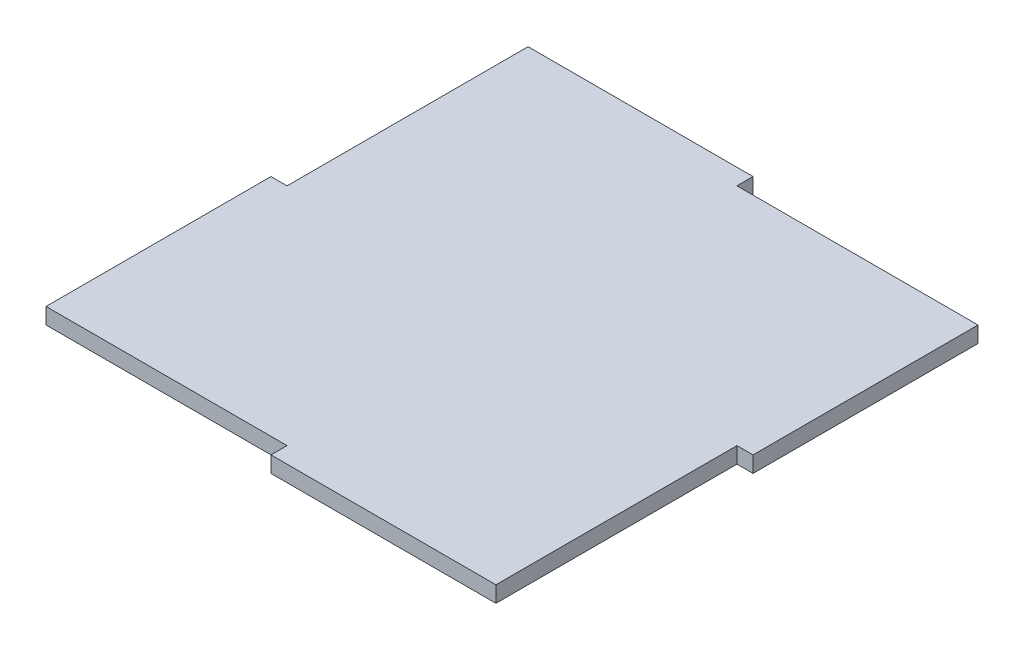
ISO-10303-21;
HEADER;
FILE_DESCRIPTION(('STEP AP214'),'2;1');
FILE_NAME('part.step','',(''),(''),'','','');
FILE_SCHEMA(('AUTOMOTIVE_DESIGN { 1 0 10303 214 1 1 1 1 }'));
ENDSEC;
DATA;
#1=APPLICATION_CONTEXT('core data for automotive mechanical design processes');
#2=APPLICATION_PROTOCOL_DEFINITION('international standard','automotive_design',2000,#1);
#3=PRODUCT_CONTEXT('',#1,'mechanical');
#4=PRODUCT('Part','Part','',(#3));
#5=PRODUCT_RELATED_PRODUCT_CATEGORY('part','',(#4));
#6=PRODUCT_DEFINITION_FORMATION('','',#4);
#7=PRODUCT_DEFINITION_CONTEXT('part definition',#1,'design');
#8=PRODUCT_DEFINITION('design','',#6,#7);
#9=PRODUCT_DEFINITION_SHAPE('','',#8);
#10=(LENGTH_UNIT() NAMED_UNIT(*) SI_UNIT(.MILLI.,.METRE.));
#11=(NAMED_UNIT(*) PLANE_ANGLE_UNIT() SI_UNIT($,.RADIAN.));
#12=(NAMED_UNIT(*) SI_UNIT($,.STERADIAN.) SOLID_ANGLE_UNIT());
#13=UNCERTAINTY_MEASURE_WITH_UNIT(LENGTH_MEASURE(1.E-05),#10,'distance_accuracy_value','');
#14=(GEOMETRIC_REPRESENTATION_CONTEXT(3) GLOBAL_UNCERTAINTY_ASSIGNED_CONTEXT((#13)) GLOBAL_UNIT_ASSIGNED_CONTEXT((#10,
#11,#12)) REPRESENTATION_CONTEXT('',''));
#15=CARTESIAN_POINT('',(0.,0.,0.));
#16=DIRECTION('',(0.,0.,1.));
#17=DIRECTION('',(1.,0.,0.));
#18=AXIS2_PLACEMENT_3D('',#15,#16,#17);
#19=CARTESIAN_POINT('',(0.,6.35,-4.41271186440678));
#20=DIRECTION('',(0.,0.,-1.));
#21=DIRECTION('',(-1.,0.,0.));
#22=AXIS2_PLACEMENT_3D('',#19,#20,#21);
#23=PLANE('',#22);
#24=DIRECTION('',(1.,0.,0.));
#25=VECTOR('',#24,1.);
#26=CARTESIAN_POINT('',(0.,0.,-4.41271186440678));
#27=LINE('',#26,#25);
#28=CARTESIAN_POINT('',(-118.856214689266,0.,-4.41271186440677));
#29=VERTEX_POINT('',#28);
#30=CARTESIAN_POINT('',(-112.506214689266,0.,-4.41271186440677));
#31=VERTEX_POINT('',#30);
#32=EDGE_CURVE('E154',#29,#31,#27,.T.);
#33=ORIENTED_EDGE('',*,*,#32,.F.);
#34=DIRECTION('',(0.,-1.,0.));
#35=VECTOR('',#34,1.);
#36=CARTESIAN_POINT('',(-118.856214689266,6.35,-4.41271186440677));
#37=LINE('',#36,#35);
#38=CARTESIAN_POINT('',(-118.856214689266,6.35,-4.41271186440677));
#39=VERTEX_POINT('',#38);
#40=EDGE_CURVE('E11',#39,#29,#37,.T.);
#41=ORIENTED_EDGE('',*,*,#40,.F.);
#42=DIRECTION('',(1.,0.,0.));
#43=VECTOR('',#42,1.);
#44=CARTESIAN_POINT('',(0.,6.35,-4.41271186440678));
#45=LINE('',#44,#43);
#46=CARTESIAN_POINT('',(-112.506214689266,6.35,-4.41271186440677));
#47=VERTEX_POINT('',#46);
#48=EDGE_CURVE('E186',#39,#47,#45,.T.);
#49=ORIENTED_EDGE('',*,*,#48,.T.);
#50=DIRECTION('',(0.,-1.,0.));
#51=VECTOR('',#50,1.);
#52=CARTESIAN_POINT('',(-112.506214689266,6.35,-4.41271186440677));
#53=LINE('',#52,#51);
#54=EDGE_CURVE('E99',#47,#31,#53,.T.);
#55=ORIENTED_EDGE('',*,*,#54,.T.);
#56=EDGE_LOOP('',(#33,#41,#49,#55));
#57=FACE_BOUND('',#56,.T.);
#58=ADVANCED_FACE('F37',(#57),#23,.T.);
#59=CARTESIAN_POINT('',(-118.856214689266,6.35,0.));
#60=DIRECTION('',(-1.,0.,0.));
#61=DIRECTION('',(0.,0.,1.));
#62=AXIS2_PLACEMENT_3D('',#59,#60,#61);
#63=PLANE('',#62);
#64=DIRECTION('',(0.,0.,-1.));
#65=VECTOR('',#64,1.);
#66=CARTESIAN_POINT('',(-118.856214689266,0.,0.));
#67=LINE('',#66,#65);
#68=CARTESIAN_POINT('',(-118.856214689266,0.,84.4872881355932));
#69=VERTEX_POINT('',#68);
#70=EDGE_CURVE('E157',#69,#29,#67,.T.);
#71=ORIENTED_EDGE('',*,*,#70,.F.);
#72=DIRECTION('',(0.,-1.,0.));
#73=VECTOR('',#72,1.);
#74=CARTESIAN_POINT('',(-118.856214689266,6.35,84.4872881355932));
#75=LINE('',#74,#73);
#76=CARTESIAN_POINT('',(-118.856214689266,6.35,84.4872881355932));
#77=VERTEX_POINT('',#76);
#78=EDGE_CURVE('E45',#77,#69,#75,.T.);
#79=ORIENTED_EDGE('',*,*,#78,.F.);
#80=DIRECTION('',(0.,0.,-1.));
#81=VECTOR('',#80,1.);
#82=CARTESIAN_POINT('',(-118.856214689266,6.35,0.));
#83=LINE('',#82,#81);
#84=EDGE_CURVE('E223',#77,#39,#83,.T.);
#85=ORIENTED_EDGE('',*,*,#84,.T.);
#86=ORIENTED_EDGE('',*,*,#40,.T.);
#87=EDGE_LOOP('',(#71,#79,#85,#86));
#88=FACE_BOUND('',#87,.T.);
#89=ADVANCED_FACE('F211',(#88),#63,.T.);
#90=CARTESIAN_POINT('',(0.,6.35,84.4872881355932));
#91=DIRECTION('',(0.,0.,1.));
#92=DIRECTION('',(1.,0.,0.));
#93=AXIS2_PLACEMENT_3D('',#90,#91,#92);
#94=PLANE('',#93);
#95=DIRECTION('',(-1.,0.,0.));
#96=VECTOR('',#95,1.);
#97=CARTESIAN_POINT('',(0.,0.,84.4872881355932));
#98=LINE('',#97,#96);
#99=CARTESIAN_POINT('',(-23.6062146892655,0.,84.4872881355932));
#100=VERTEX_POINT('',#99);
#101=EDGE_CURVE('E160',#100,#69,#98,.T.);
#102=ORIENTED_EDGE('',*,*,#101,.F.);
#103=DIRECTION('',(0.,-1.,0.));
#104=VECTOR('',#103,1.);
#105=CARTESIAN_POINT('',(-23.6062146892655,6.35,84.4872881355932));
#106=LINE('',#105,#104);
#107=CARTESIAN_POINT('',(-23.6062146892655,6.35,84.4872881355932));
#108=VERTEX_POINT('',#107);
#109=EDGE_CURVE('E200',#108,#100,#106,.T.);
#110=ORIENTED_EDGE('',*,*,#109,.F.);
#111=DIRECTION('',(-1.,0.,0.));
#112=VECTOR('',#111,1.);
#113=CARTESIAN_POINT('',(0.,6.35,84.4872881355932));
#114=LINE('',#113,#112);
#115=EDGE_CURVE('E207',#108,#77,#114,.T.);
#116=ORIENTED_EDGE('',*,*,#115,.T.);
#117=ORIENTED_EDGE('',*,*,#78,.T.);
#118=EDGE_LOOP('',(#102,#110,#116,#117));
#119=FACE_BOUND('',#118,.T.);
#120=ADVANCED_FACE('F205',(#119),#94,.T.);
#121=CARTESIAN_POINT('',(-23.6062146892653,6.35,0.));
#122=DIRECTION('',(-1.,0.,0.));
#123=DIRECTION('',(0.,0.,1.));
#124=AXIS2_PLACEMENT_3D('',#121,#122,#123);
#125=PLANE('',#124);
#126=DIRECTION('',(0.,0.,-1.));
#127=VECTOR('',#126,1.);
#128=CARTESIAN_POINT('',(-23.6062146892653,0.,0.));
#129=LINE('',#128,#127);
#130=CARTESIAN_POINT('',(-23.6062146892655,0.,90.8372881355932));
#131=VERTEX_POINT('',#130);
#132=EDGE_CURVE('E163',#131,#100,#129,.T.);
#133=ORIENTED_EDGE('',*,*,#132,.F.);
#134=DIRECTION('',(0.,-1.,0.));
#135=VECTOR('',#134,1.);
#136=CARTESIAN_POINT('',(-23.6062146892655,6.35,90.8372881355932));
#137=LINE('',#136,#135);
#138=CARTESIAN_POINT('',(-23.6062146892655,6.35,90.8372881355932));
#139=VERTEX_POINT('',#138);
#140=EDGE_CURVE('E198',#139,#131,#137,.T.);
#141=ORIENTED_EDGE('',*,*,#140,.F.);
#142=DIRECTION('',(0.,0.,-1.));
#143=VECTOR('',#142,1.);
#144=CARTESIAN_POINT('',(-23.6062146892653,6.35,0.));
#145=LINE('',#144,#143);
#146=EDGE_CURVE('E220',#139,#108,#145,.T.);
#147=ORIENTED_EDGE('',*,*,#146,.T.);
#148=ORIENTED_EDGE('',*,*,#109,.T.);
#149=EDGE_LOOP('',(#133,#141,#147,#148));
#150=FACE_BOUND('',#149,.T.);
#151=ADVANCED_FACE('F217',(#150),#125,.T.);
#152=CARTESIAN_POINT('',(0.,6.35,90.8372881355932));
#153=DIRECTION('',(0.,0.,1.));
#154=DIRECTION('',(1.,0.,0.));
#155=AXIS2_PLACEMENT_3D('',#152,#153,#154);
#156=PLANE('',#155);
#157=DIRECTION('',(-1.,0.,0.));
#158=VECTOR('',#157,1.);
#159=CARTESIAN_POINT('',(0.,0.,90.8372881355932));
#160=LINE('',#159,#158);
#161=CARTESIAN_POINT('',(65.2937853107345,0.,90.8372881355932));
#162=VERTEX_POINT('',#161);
#163=EDGE_CURVE('E166',#162,#131,#160,.T.);
#164=ORIENTED_EDGE('',*,*,#163,.F.);
#165=DIRECTION('',(0.,-1.,0.));
#166=VECTOR('',#165,1.);
#167=CARTESIAN_POINT('',(65.2937853107345,6.35,90.8372881355932));
#168=LINE('',#167,#166);
#169=CARTESIAN_POINT('',(65.2937853107345,6.35,90.8372881355932));
#170=VERTEX_POINT('',#169);
#171=EDGE_CURVE('E196',#170,#162,#168,.T.);
#172=ORIENTED_EDGE('',*,*,#171,.F.);
#173=DIRECTION('',(-1.,0.,0.));
#174=VECTOR('',#173,1.);
#175=CARTESIAN_POINT('',(0.,6.35,90.8372881355932));
#176=LINE('',#175,#174);
#177=EDGE_CURVE('E225',#170,#139,#176,.T.);
#178=ORIENTED_EDGE('',*,*,#177,.T.);
#179=ORIENTED_EDGE('',*,*,#140,.T.);
#180=EDGE_LOOP('',(#164,#172,#178,#179));
#181=FACE_BOUND('',#180,.T.);
#182=ADVANCED_FACE('F255',(#181),#156,.T.);
#183=CARTESIAN_POINT('',(65.2937853107345,6.35,0.));
#184=DIRECTION('',(1.,0.,0.));
#185=DIRECTION('',(0.,0.,-1.));
#186=AXIS2_PLACEMENT_3D('',#183,#184,#185);
#187=PLANE('',#186);
#188=DIRECTION('',(0.,0.,1.));
#189=VECTOR('',#188,1.);
#190=CARTESIAN_POINT('',(65.2937853107345,0.,0.));
#191=LINE('',#190,#189);
#192=CARTESIAN_POINT('',(65.2937853107345,0.,-4.41271186440677));
#193=VERTEX_POINT('',#192);
#194=EDGE_CURVE('E169',#193,#162,#191,.T.);
#195=ORIENTED_EDGE('',*,*,#194,.F.);
#196=DIRECTION('',(0.,-1.,0.));
#197=VECTOR('',#196,1.);
#198=CARTESIAN_POINT('',(65.2937853107345,6.35,-4.41271186440677));
#199=LINE('',#198,#197);
#200=CARTESIAN_POINT('',(65.2937853107345,6.35,-4.41271186440677));
#201=VERTEX_POINT('',#200);
#202=EDGE_CURVE('E194',#201,#193,#199,.T.);
#203=ORIENTED_EDGE('',*,*,#202,.F.);
#204=DIRECTION('',(0.,0.,1.));
#205=VECTOR('',#204,1.);
#206=CARTESIAN_POINT('',(65.2937853107345,6.35,0.));
#207=LINE('',#206,#205);
#208=EDGE_CURVE('E231',#201,#170,#207,.T.);
#209=ORIENTED_EDGE('',*,*,#208,.T.);
#210=ORIENTED_EDGE('',*,*,#171,.T.);
#211=EDGE_LOOP('',(#195,#203,#209,#210));
#212=FACE_BOUND('',#211,.T.);
#213=ADVANCED_FACE('F258',(#212),#187,.T.);
#214=CARTESIAN_POINT('',(0.,6.35,-4.41271186440676));
#215=DIRECTION('',(0.,0.,1.));
#216=DIRECTION('',(1.,0.,0.));
#217=AXIS2_PLACEMENT_3D('',#214,#215,#216);
#218=PLANE('',#217);
#219=DIRECTION('',(-1.,0.,0.));
#220=VECTOR('',#219,1.);
#221=CARTESIAN_POINT('',(0.,0.,-4.41271186440676));
#222=LINE('',#221,#220);
#223=CARTESIAN_POINT('',(71.6437853107345,0.,-4.41271186440677));
#224=VERTEX_POINT('',#223);
#225=EDGE_CURVE('E172',#224,#193,#222,.T.);
#226=ORIENTED_EDGE('',*,*,#225,.F.);
#227=DIRECTION('',(0.,-1.,0.));
#228=VECTOR('',#227,1.);
#229=CARTESIAN_POINT('',(71.6437853107345,6.35,-4.41271186440677));
#230=LINE('',#229,#228);
#231=CARTESIAN_POINT('',(71.6437853107345,6.35,-4.41271186440677));
#232=VERTEX_POINT('',#231);
#233=EDGE_CURVE('E192',#232,#224,#230,.T.);
#234=ORIENTED_EDGE('',*,*,#233,.F.);
#235=DIRECTION('',(-1.,0.,0.));
#236=VECTOR('',#235,1.);
#237=CARTESIAN_POINT('',(0.,6.35,-4.41271186440676));
#238=LINE('',#237,#236);
#239=EDGE_CURVE('E234',#232,#201,#238,.T.);
#240=ORIENTED_EDGE('',*,*,#239,.T.);
#241=ORIENTED_EDGE('',*,*,#202,.T.);
#242=EDGE_LOOP('',(#226,#234,#240,#241));
#243=FACE_BOUND('',#242,.T.);
#244=ADVANCED_FACE('F262',(#243),#218,.T.);
#245=CARTESIAN_POINT('',(71.6437853107345,6.35,0.));
#246=DIRECTION('',(1.,0.,0.));
#247=DIRECTION('',(0.,0.,-1.));
#248=AXIS2_PLACEMENT_3D('',#245,#246,#247);
#249=PLANE('',#248);
#250=DIRECTION('',(0.,0.,1.));
#251=VECTOR('',#250,1.);
#252=CARTESIAN_POINT('',(71.6437853107345,0.,0.));
#253=LINE('',#252,#251);
#254=CARTESIAN_POINT('',(71.6437853107345,0.,-93.3127118644068));
#255=VERTEX_POINT('',#254);
#256=EDGE_CURVE('E175',#255,#224,#253,.T.);
#257=ORIENTED_EDGE('',*,*,#256,.F.);
#258=DIRECTION('',(0.,-1.,0.));
#259=VECTOR('',#258,1.);
#260=CARTESIAN_POINT('',(71.6437853107345,6.35,-93.3127118644068));
#261=LINE('',#260,#259);
#262=CARTESIAN_POINT('',(71.6437853107345,6.35,-93.3127118644068));
#263=VERTEX_POINT('',#262);
#264=EDGE_CURVE('E190',#263,#255,#261,.T.);
#265=ORIENTED_EDGE('',*,*,#264,.F.);
#266=DIRECTION('',(0.,0.,1.));
#267=VECTOR('',#266,1.);
#268=CARTESIAN_POINT('',(71.6437853107345,6.35,0.));
#269=LINE('',#268,#267);
#270=EDGE_CURVE('E237',#263,#232,#269,.T.);
#271=ORIENTED_EDGE('',*,*,#270,.T.);
#272=ORIENTED_EDGE('',*,*,#233,.T.);
#273=EDGE_LOOP('',(#257,#265,#271,#272));
#274=FACE_BOUND('',#273,.T.);
#275=ADVANCED_FACE('F266',(#274),#249,.T.);
#276=CARTESIAN_POINT('',(0.,6.35,-93.3127118644068));
#277=DIRECTION('',(0.,0.,-1.));
#278=DIRECTION('',(-1.,0.,0.));
#279=AXIS2_PLACEMENT_3D('',#276,#277,#278);
#280=PLANE('',#279);
#281=DIRECTION('',(1.,0.,0.));
#282=VECTOR('',#281,1.);
#283=CARTESIAN_POINT('',(0.,0.,-93.3127118644068));
#284=LINE('',#283,#282);
#285=CARTESIAN_POINT('',(-23.6062146892655,0.,-93.3127118644068));
#286=VERTEX_POINT('',#285);
#287=EDGE_CURVE('E178',#286,#255,#284,.T.);
#288=ORIENTED_EDGE('',*,*,#287,.F.);
#289=DIRECTION('',(0.,-1.,0.));
#290=VECTOR('',#289,1.);
#291=CARTESIAN_POINT('',(-23.6062146892655,6.35,-93.3127118644068));
#292=LINE('',#291,#290);
#293=CARTESIAN_POINT('',(-23.6062146892655,6.35,-93.3127118644068));
#294=VERTEX_POINT('',#293);
#295=EDGE_CURVE('E140',#294,#286,#292,.T.);
#296=ORIENTED_EDGE('',*,*,#295,.F.);
#297=DIRECTION('',(1.,0.,0.));
#298=VECTOR('',#297,1.);
#299=CARTESIAN_POINT('',(0.,6.35,-93.3127118644068));
#300=LINE('',#299,#298);
#301=EDGE_CURVE('E147',#294,#263,#300,.T.);
#302=ORIENTED_EDGE('',*,*,#301,.T.);
#303=ORIENTED_EDGE('',*,*,#264,.T.);
#304=EDGE_LOOP('',(#288,#296,#302,#303));
#305=FACE_BOUND('',#304,.T.);
#306=ADVANCED_FACE('F241',(#305),#280,.T.);
#307=CARTESIAN_POINT('',(-23.6062146892655,6.35,0.));
#308=DIRECTION('',(1.,0.,0.));
#309=DIRECTION('',(0.,0.,-1.));
#310=AXIS2_PLACEMENT_3D('',#307,#308,#309);
#311=PLANE('',#310);
#312=DIRECTION('',(0.,0.,1.));
#313=VECTOR('',#312,1.);
#314=CARTESIAN_POINT('',(-23.6062146892655,0.,0.));
#315=LINE('',#314,#313);
#316=CARTESIAN_POINT('',(-23.6062146892655,0.,-99.6627118644068));
#317=VERTEX_POINT('',#316);
#318=EDGE_CURVE('E135',#317,#286,#315,.T.);
#319=ORIENTED_EDGE('',*,*,#318,.F.);
#320=DIRECTION('',(0.,-1.,0.));
#321=VECTOR('',#320,1.);
#322=CARTESIAN_POINT('',(-23.6062146892655,6.35,-99.6627118644068));
#323=LINE('',#322,#321);
#324=CARTESIAN_POINT('',(-23.6062146892655,6.35,-99.6627118644068));
#325=VERTEX_POINT('',#324);
#326=EDGE_CURVE('E130',#325,#317,#323,.T.);
#327=ORIENTED_EDGE('',*,*,#326,.F.);
#328=DIRECTION('',(0.,0.,1.));
#329=VECTOR('',#328,1.);
#330=CARTESIAN_POINT('',(-23.6062146892655,6.35,0.));
#331=LINE('',#330,#329);
#332=EDGE_CURVE('E133',#325,#294,#331,.T.);
#333=ORIENTED_EDGE('',*,*,#332,.T.);
#334=ORIENTED_EDGE('',*,*,#295,.T.);
#335=EDGE_LOOP('',(#319,#327,#333,#334));
#336=FACE_BOUND('',#335,.T.);
#337=ADVANCED_FACE('F132',(#336),#311,.T.);
#338=CARTESIAN_POINT('',(0.,6.35,-99.6627118644068));
#339=DIRECTION('',(0.,0.,-1.));
#340=DIRECTION('',(-1.,0.,0.));
#341=AXIS2_PLACEMENT_3D('',#338,#339,#340);
#342=PLANE('',#341);
#343=DIRECTION('',(1.,0.,0.));
#344=VECTOR('',#343,1.);
#345=CARTESIAN_POINT('',(0.,0.,-99.6627118644068));
#346=LINE('',#345,#344);
#347=CARTESIAN_POINT('',(-112.506214689266,0.,-99.6627118644068));
#348=VERTEX_POINT('',#347);
#349=EDGE_CURVE('E182',#348,#317,#346,.T.);
#350=ORIENTED_EDGE('',*,*,#349,.F.);
#351=DIRECTION('',(0.,-1.,0.));
#352=VECTOR('',#351,1.);
#353=CARTESIAN_POINT('',(-112.506214689266,6.35,-99.6627118644068));
#354=LINE('',#353,#352);
#355=CARTESIAN_POINT('',(-112.506214689266,6.35,-99.6627118644068));
#356=VERTEX_POINT('',#355);
#357=EDGE_CURVE('E92',#356,#348,#354,.T.);
#358=ORIENTED_EDGE('',*,*,#357,.F.);
#359=DIRECTION('',(1.,0.,0.));
#360=VECTOR('',#359,1.);
#361=CARTESIAN_POINT('',(0.,6.35,-99.6627118644068));
#362=LINE('',#361,#360);
#363=EDGE_CURVE('E144',#356,#325,#362,.T.);
#364=ORIENTED_EDGE('',*,*,#363,.T.);
#365=ORIENTED_EDGE('',*,*,#326,.T.);
#366=EDGE_LOOP('',(#350,#358,#364,#365));
#367=FACE_BOUND('',#366,.T.);
#368=ADVANCED_FACE('F149',(#367),#342,.T.);
#369=CARTESIAN_POINT('',(-112.506214689266,6.35,0.));
#370=DIRECTION('',(1.,0.,0.));
#371=DIRECTION('',(0.,0.,-1.));
#372=AXIS2_PLACEMENT_3D('',#369,#370,#371);
#373=PLANE('',#372);
#374=DIRECTION('',(0.,0.,1.));
#375=VECTOR('',#374,1.);
#376=CARTESIAN_POINT('',(-112.506214689266,0.,0.));
#377=LINE('',#376,#375);
#378=EDGE_CURVE('E184',#348,#31,#377,.T.);
#379=ORIENTED_EDGE('',*,*,#378,.T.);
#380=ORIENTED_EDGE('',*,*,#54,.F.);
#381=DIRECTION('',(0.,0.,1.));
#382=VECTOR('',#381,1.);
#383=CARTESIAN_POINT('',(-112.506214689266,6.35,0.));
#384=LINE('',#383,#382);
#385=EDGE_CURVE('E53',#356,#47,#384,.T.);
#386=ORIENTED_EDGE('',*,*,#385,.F.);
#387=ORIENTED_EDGE('',*,*,#357,.T.);
#388=EDGE_LOOP('',(#379,#380,#386,#387));
#389=FACE_BOUND('',#388,.T.);
#390=ADVANCED_FACE('F243',(#389),#373,.F.);
#391=CARTESIAN_POINT('',(0.,6.35,0.));
#392=DIRECTION('',(0.,1.,0.));
#393=DIRECTION('',(0.,0.,1.));
#394=AXIS2_PLACEMENT_3D('',#391,#392,#393);
#395=PLANE('',#394);
#396=ORIENTED_EDGE('',*,*,#48,.F.);
#397=ORIENTED_EDGE('',*,*,#84,.F.);
#398=ORIENTED_EDGE('',*,*,#115,.F.);
#399=ORIENTED_EDGE('',*,*,#146,.F.);
#400=ORIENTED_EDGE('',*,*,#177,.F.);
#401=ORIENTED_EDGE('',*,*,#208,.F.);
#402=ORIENTED_EDGE('',*,*,#239,.F.);
#403=ORIENTED_EDGE('',*,*,#270,.F.);
#404=ORIENTED_EDGE('',*,*,#301,.F.);
#405=ORIENTED_EDGE('',*,*,#332,.F.);
#406=ORIENTED_EDGE('',*,*,#363,.F.);
#407=ORIENTED_EDGE('',*,*,#385,.T.);
#408=EDGE_LOOP('',(#396,#397,#398,#399,#400,#401,#402,#403,#404,#405,#406,#407));
#409=FACE_BOUND('',#408,.T.);
#410=ADVANCED_FACE('F143',(#409),#395,.T.);
#411=CARTESIAN_POINT('',(0.,0.,0.));
#412=DIRECTION('',(0.,1.,0.));
#413=DIRECTION('',(0.,0.,1.));
#414=AXIS2_PLACEMENT_3D('',#411,#412,#413);
#415=PLANE('',#414);
#416=ORIENTED_EDGE('',*,*,#32,.T.);
#417=ORIENTED_EDGE('',*,*,#378,.F.);
#418=ORIENTED_EDGE('',*,*,#349,.T.);
#419=ORIENTED_EDGE('',*,*,#318,.T.);
#420=ORIENTED_EDGE('',*,*,#287,.T.);
#421=ORIENTED_EDGE('',*,*,#256,.T.);
#422=ORIENTED_EDGE('',*,*,#225,.T.);
#423=ORIENTED_EDGE('',*,*,#194,.T.);
#424=ORIENTED_EDGE('',*,*,#163,.T.);
#425=ORIENTED_EDGE('',*,*,#132,.T.);
#426=ORIENTED_EDGE('',*,*,#101,.T.);
#427=ORIENTED_EDGE('',*,*,#70,.T.);
#428=EDGE_LOOP('',(#416,#417,#418,#419,#420,#421,#422,#423,#424,#425,#426,#427));
#429=FACE_BOUND('',#428,.T.);
#430=ADVANCED_FACE('F213',(#429),#415,.F.);
#431=CLOSED_SHELL('',(#58,#89,#120,#151,#182,#213,#244,#275,#306,#337,#368,#390,#410,#430));
#432=MANIFOLD_SOLID_BREP('B2',#431);
#433=ADVANCED_BREP_SHAPE_REPRESENTATION('',(#18,#432),#14);
#434=SHAPE_DEFINITION_REPRESENTATION(#9,#433);
ENDSEC;
END-ISO-10303-21;
